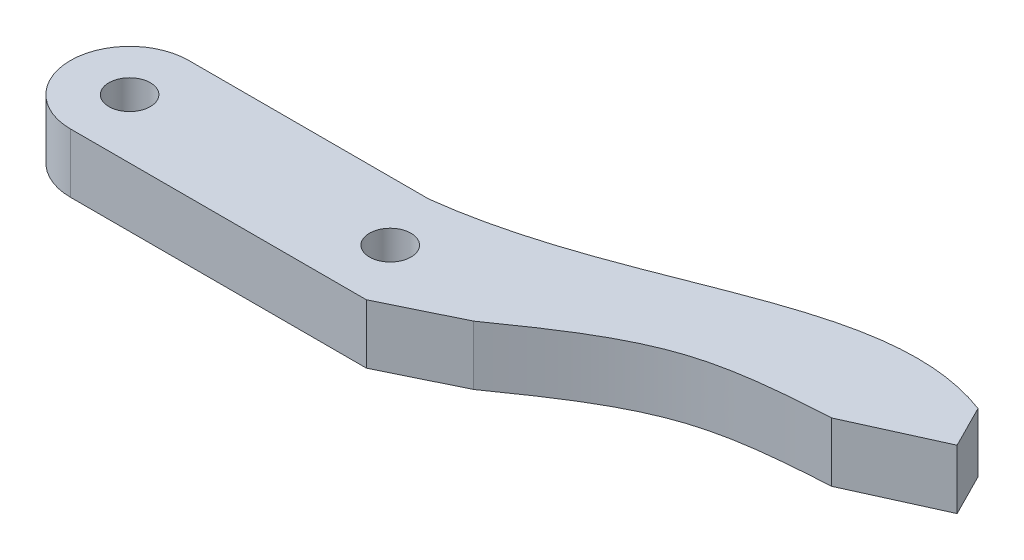
ISO-10303-21;
HEADER;
FILE_DESCRIPTION(('STEP AP214'),'2;1');
FILE_NAME('part.step','',(''),(''),'','','');
FILE_SCHEMA(('AUTOMOTIVE_DESIGN { 1 0 10303 214 1 1 1 1 }'));
ENDSEC;
DATA;
#1=APPLICATION_CONTEXT('core data for automotive mechanical design processes');
#2=APPLICATION_PROTOCOL_DEFINITION('international standard','automotive_design',2000,#1);
#3=PRODUCT_CONTEXT('',#1,'mechanical');
#4=PRODUCT('Part','Part','',(#3));
#5=PRODUCT_RELATED_PRODUCT_CATEGORY('part','',(#4));
#6=PRODUCT_DEFINITION_FORMATION('','',#4);
#7=PRODUCT_DEFINITION_CONTEXT('part definition',#1,'design');
#8=PRODUCT_DEFINITION('design','',#6,#7);
#9=PRODUCT_DEFINITION_SHAPE('','',#8);
#10=(LENGTH_UNIT() NAMED_UNIT(*) SI_UNIT(.MILLI.,.METRE.));
#11=(NAMED_UNIT(*) PLANE_ANGLE_UNIT() SI_UNIT($,.RADIAN.));
#12=(NAMED_UNIT(*) SI_UNIT($,.STERADIAN.) SOLID_ANGLE_UNIT());
#13=UNCERTAINTY_MEASURE_WITH_UNIT(LENGTH_MEASURE(1.E-05),#10,'distance_accuracy_value','');
#14=(GEOMETRIC_REPRESENTATION_CONTEXT(3) GLOBAL_UNCERTAINTY_ASSIGNED_CONTEXT((#13)) GLOBAL_UNIT_ASSIGNED_CONTEXT((#10,
#11,#12)) REPRESENTATION_CONTEXT('',''));
#15=CARTESIAN_POINT('',(0.,0.,0.));
#16=DIRECTION('',(0.,0.,1.));
#17=DIRECTION('',(1.,0.,0.));
#18=AXIS2_PLACEMENT_3D('',#15,#16,#17);
#19=CARTESIAN_POINT('',(0.,5.,-5.));
#20=DIRECTION('',(0.,0.,-1.));
#21=DIRECTION('',(-1.,0.,0.));
#22=AXIS2_PLACEMENT_3D('',#19,#20,#21);
#23=PLANE('',#22);
#24=DIRECTION('',(1.,0.,0.));
#25=VECTOR('',#24,1.);
#26=CARTESIAN_POINT('',(0.,5.,-5.));
#27=LINE('',#26,#25);
#28=CARTESIAN_POINT('',(0.,5.,-5.));
#29=VERTEX_POINT('',#28);
#30=CARTESIAN_POINT('',(20.2518777323325,5.,-5.));
#31=VERTEX_POINT('',#30);
#32=EDGE_CURVE('E223',#29,#31,#27,.T.);
#33=ORIENTED_EDGE('',*,*,#32,.T.);
#34=DIRECTION('',(0.,1.,0.));
#35=VECTOR('',#34,1.);
#36=CARTESIAN_POINT('',(20.2518777323325,0.,-5.));
#37=LINE('',#36,#35);
#38=CARTESIAN_POINT('',(20.2518777323325,0.,-5.));
#39=VERTEX_POINT('',#38);
#40=EDGE_CURVE('E139',#39,#31,#37,.T.);
#41=ORIENTED_EDGE('',*,*,#40,.F.);
#42=DIRECTION('',(1.,0.,0.));
#43=VECTOR('',#42,1.);
#44=CARTESIAN_POINT('',(0.,0.,-5.));
#45=LINE('',#44,#43);
#46=CARTESIAN_POINT('',(0.,0.,-5.));
#47=VERTEX_POINT('',#46);
#48=EDGE_CURVE('E126',#47,#39,#45,.T.);
#49=ORIENTED_EDGE('',*,*,#48,.F.);
#50=DIRECTION('',(0.,-1.,0.));
#51=VECTOR('',#50,1.);
#52=CARTESIAN_POINT('',(0.,5.,-5.));
#53=LINE('',#52,#51);
#54=EDGE_CURVE('E53',#29,#47,#53,.T.);
#55=ORIENTED_EDGE('',*,*,#54,.F.);
#56=EDGE_LOOP('',(#33,#41,#49,#55));
#57=FACE_BOUND('',#56,.T.);
#58=ADVANCED_FACE('F43',(#57),#23,.T.);
#59=CARTESIAN_POINT('',(0.,5.,0.));
#60=DIRECTION('',(0.,-1.,0.));
#61=DIRECTION('',(0.,0.,-1.));
#62=AXIS2_PLACEMENT_3D('',#59,#60,#61);
#63=CYLINDRICAL_SURFACE('',#62,5.);
#64=CARTESIAN_POINT('',(0.,0.,0.));
#65=DIRECTION('',(0.,1.,0.));
#66=DIRECTION('',(0.,0.,1.));
#67=AXIS2_PLACEMENT_3D('',#64,#65,#66);
#68=CIRCLE('',#67,5.);
#69=CARTESIAN_POINT('',(0.,0.,5.));
#70=VERTEX_POINT('',#69);
#71=EDGE_CURVE('E233',#47,#70,#68,.T.);
#72=ORIENTED_EDGE('',*,*,#71,.T.);
#73=DIRECTION('',(0.,-1.,0.));
#74=VECTOR('',#73,1.);
#75=CARTESIAN_POINT('',(0.,5.,5.));
#76=LINE('',#75,#74);
#77=CARTESIAN_POINT('',(0.,5.,5.));
#78=VERTEX_POINT('',#77);
#79=EDGE_CURVE('E11',#78,#70,#76,.T.);
#80=ORIENTED_EDGE('',*,*,#79,.F.);
#81=CARTESIAN_POINT('',(0.,5.,0.));
#82=DIRECTION('',(0.,1.,0.));
#83=DIRECTION('',(0.,0.,1.));
#84=AXIS2_PLACEMENT_3D('',#81,#82,#83);
#85=CIRCLE('',#84,5.);
#86=EDGE_CURVE('E217',#29,#78,#85,.T.);
#87=ORIENTED_EDGE('',*,*,#86,.F.);
#88=ORIENTED_EDGE('',*,*,#54,.T.);
#89=EDGE_LOOP('',(#72,#80,#87,#88));
#90=FACE_BOUND('',#89,.T.);
#91=ADVANCED_FACE('F245',(#90),#63,.T.);
#92=CARTESIAN_POINT('',(0.,5.,5.));
#93=DIRECTION('',(0.,0.,-1.));
#94=DIRECTION('',(-1.,0.,0.));
#95=AXIS2_PLACEMENT_3D('',#92,#93,#94);
#96=PLANE('',#95);
#97=DIRECTION('',(1.,0.,0.));
#98=VECTOR('',#97,1.);
#99=CARTESIAN_POINT('',(0.,0.,5.));
#100=LINE('',#99,#98);
#101=CARTESIAN_POINT('',(24.99,0.,5.));
#102=VERTEX_POINT('',#101);
#103=EDGE_CURVE('E72',#70,#102,#100,.T.);
#104=ORIENTED_EDGE('',*,*,#103,.T.);
#105=DIRECTION('',(0.,1.,0.));
#106=VECTOR('',#105,1.);
#107=CARTESIAN_POINT('',(24.99,0.,5.));
#108=LINE('',#107,#106);
#109=CARTESIAN_POINT('',(24.99,5.,5.));
#110=VERTEX_POINT('',#109);
#111=EDGE_CURVE('E197',#102,#110,#108,.T.);
#112=ORIENTED_EDGE('',*,*,#111,.T.);
#113=DIRECTION('',(1.,0.,0.));
#114=VECTOR('',#113,1.);
#115=CARTESIAN_POINT('',(0.,5.,5.));
#116=LINE('',#115,#114);
#117=EDGE_CURVE('E103',#78,#110,#116,.T.);
#118=ORIENTED_EDGE('',*,*,#117,.F.);
#119=ORIENTED_EDGE('',*,*,#79,.T.);
#120=EDGE_LOOP('',(#104,#112,#118,#119));
#121=FACE_BOUND('',#120,.T.);
#122=ADVANCED_FACE('F264',(#121),#96,.F.);
#123=CARTESIAN_POINT('',(0.,5.,0.));
#124=DIRECTION('',(0.,-1.,0.));
#125=DIRECTION('',(0.,0.,-1.));
#126=AXIS2_PLACEMENT_3D('',#123,#124,#125);
#127=CYLINDRICAL_SURFACE('',#126,1.75);
#128=CARTESIAN_POINT('',(0.,5.,0.));
#129=DIRECTION('',(0.,1.,0.));
#130=DIRECTION('',(0.,0.,1.));
#131=AXIS2_PLACEMENT_3D('',#128,#129,#130);
#132=CIRCLE('',#131,1.75);
#133=CARTESIAN_POINT('',(0.,5.,1.75));
#134=VERTEX_POINT('',#133);
#135=EDGE_CURVE('E213',#134,#134,#132,.T.);
#136=ORIENTED_EDGE('',*,*,#135,.T.);
#137=EDGE_LOOP('',(#136));
#138=FACE_BOUND('',#137,.T.);
#139=CARTESIAN_POINT('',(0.,0.,0.));
#140=DIRECTION('',(0.,1.,0.));
#141=DIRECTION('',(0.,0.,1.));
#142=AXIS2_PLACEMENT_3D('',#139,#140,#141);
#143=CIRCLE('',#142,1.75);
#144=CARTESIAN_POINT('',(0.,0.,1.75));
#145=VERTEX_POINT('',#144);
#146=EDGE_CURVE('E203',#145,#145,#143,.T.);
#147=ORIENTED_EDGE('',*,*,#146,.F.);
#148=EDGE_LOOP('',(#147));
#149=FACE_BOUND('',#148,.T.);
#150=ADVANCED_FACE('F45',(#138,#149),#127,.F.);
#151=CARTESIAN_POINT('',(22.,5.,0.));
#152=DIRECTION('',(0.,-1.,0.));
#153=DIRECTION('',(0.,0.,-1.));
#154=AXIS2_PLACEMENT_3D('',#151,#152,#153);
#155=CYLINDRICAL_SURFACE('',#154,1.75);
#156=CARTESIAN_POINT('',(22.,5.,0.));
#157=DIRECTION('',(0.,1.,0.));
#158=DIRECTION('',(0.,0.,1.));
#159=AXIS2_PLACEMENT_3D('',#156,#157,#158);
#160=CIRCLE('',#159,1.75);
#161=CARTESIAN_POINT('',(22.,5.,1.75));
#162=VERTEX_POINT('',#161);
#163=EDGE_CURVE('E226',#162,#162,#160,.T.);
#164=ORIENTED_EDGE('',*,*,#163,.T.);
#165=EDGE_LOOP('',(#164));
#166=FACE_BOUND('',#165,.T.);
#167=CARTESIAN_POINT('',(22.,0.,0.));
#168=DIRECTION('',(0.,1.,0.));
#169=DIRECTION('',(0.,0.,1.));
#170=AXIS2_PLACEMENT_3D('',#167,#168,#169);
#171=CIRCLE('',#170,1.75);
#172=CARTESIAN_POINT('',(22.,0.,1.75));
#173=VERTEX_POINT('',#172);
#174=EDGE_CURVE('E218',#173,#173,#171,.T.);
#175=ORIENTED_EDGE('',*,*,#174,.F.);
#176=EDGE_LOOP('',(#175));
#177=FACE_BOUND('',#176,.T.);
#178=ADVANCED_FACE('F271',(#166,#177),#155,.F.);
#179=CARTESIAN_POINT('',(0.,5.,0.));
#180=DIRECTION('',(0.,1.,0.));
#181=DIRECTION('',(0.,0.,1.));
#182=AXIS2_PLACEMENT_3D('',#179,#180,#181);
#183=PLANE('',#182);
#184=ORIENTED_EDGE('',*,*,#135,.F.);
#185=EDGE_LOOP('',(#184));
#186=FACE_BOUND('',#185,.T.);
#187=ORIENTED_EDGE('',*,*,#86,.T.);
#188=ORIENTED_EDGE('',*,*,#117,.T.);
#189=DIRECTION('',(0.898794046299166,0.,-0.438371146789079));
#190=VECTOR('',#189,1.);
#191=CARTESIAN_POINT('',(6.77233674982274,5.,13.8853480546302));
#192=LINE('',#191,#190);
#193=CARTESIAN_POINT('',(31.08,5.,2.02970853563389));
#194=VERTEX_POINT('',#193);
#195=EDGE_CURVE('E156',#110,#194,#192,.T.);
#196=ORIENTED_EDGE('',*,*,#195,.T.);
#197=CARTESIAN_POINT('',(31.08,5.,2.0297085356339));
#198=CARTESIAN_POINT('',(34.7497609427851,5.,-0.550345092392832));
#199=CARTESIAN_POINT('',(41.4510864784731,5.,-5.2617635009767));
#200=CARTESIAN_POINT('',(49.5886885616647,5.,-5.77005682771931));
#201=CARTESIAN_POINT('',(53.27,5.,-6.));
#202=B_SPLINE_CURVE_WITH_KNOTS('',3,(#197,#198,#199,#200,#201),.UNSPECIFIED.,.F.,.F.,(4,1,4),
(0.,0.547617172638723,1.),.UNSPECIFIED.);
#203=CARTESIAN_POINT('',(53.27,5.,-6.));
#204=VERTEX_POINT('',#203);
#205=EDGE_CURVE('E254',#194,#204,#202,.T.);
#206=ORIENTED_EDGE('',*,*,#205,.T.);
#207=DIRECTION('',(-0.910876713981416,0.,0.41267858186053));
#208=VECTOR('',#207,1.);
#209=CARTESIAN_POINT('',(6.81667754386652,5.,15.0459779459223));
#210=LINE('',#209,#208);
#211=CARTESIAN_POINT('',(60.5570137118513,5.,-9.30142865488424));
#212=VERTEX_POINT('',#211);
#213=EDGE_CURVE('E191',#212,#204,#210,.T.);
#214=ORIENTED_EDGE('',*,*,#213,.F.);
#215=DIRECTION('',(0.451753427962833,0.,0.892142836278939));
#216=VECTOR('',#215,1.);
#217=CARTESIAN_POINT('',(51.9472097518166,5.,-26.3044538656701));
#218=LINE('',#217,#216);
#219=CARTESIAN_POINT('',(58.75,5.,-12.87));
#220=VERTEX_POINT('',#219);
#221=EDGE_CURVE('E188',#220,#212,#218,.T.);
#222=ORIENTED_EDGE('',*,*,#221,.F.);
#223=CARTESIAN_POINT('',(11.,5.,-5.));
#224=CARTESIAN_POINT('',(31.6705966753384,5.,-2.42219328828116));
#225=CARTESIAN_POINT('',(44.410895383929,5.,-18.2251394880137));
#226=CARTESIAN_POINT('',(58.75,5.,-12.87));
#227=B_SPLINE_CURVE_WITH_KNOTS('',3,(#223,#224,#225,#226),.UNSPECIFIED.,.F.,.F.,(4,4),(0.,1.),.UNSPECIFIED.);
#228=EDGE_CURVE('E135',#31,#220,#227,.T.);
#229=ORIENTED_EDGE('',*,*,#228,.F.);
#230=ORIENTED_EDGE('',*,*,#32,.F.);
#231=EDGE_LOOP('',(#187,#188,#196,#206,#214,#222,#229,#230));
#232=FACE_BOUND('',#231,.T.);
#233=ORIENTED_EDGE('',*,*,#163,.F.);
#234=EDGE_LOOP('',(#233));
#235=FACE_BOUND('',#234,.T.);
#236=ADVANCED_FACE('F248',(#186,#232,#235),#183,.T.);
#237=CARTESIAN_POINT('',(0.,0.,0.));
#238=DIRECTION('',(0.,1.,0.));
#239=DIRECTION('',(0.,0.,1.));
#240=AXIS2_PLACEMENT_3D('',#237,#238,#239);
#241=PLANE('',#240);
#242=ORIENTED_EDGE('',*,*,#146,.T.);
#243=EDGE_LOOP('',(#242));
#244=FACE_BOUND('',#243,.T.);
#245=ORIENTED_EDGE('',*,*,#71,.F.);
#246=ORIENTED_EDGE('',*,*,#48,.T.);
#247=CARTESIAN_POINT('',(11.,0.,-5.));
#248=CARTESIAN_POINT('',(31.6705966753384,0.,-2.42219328828116));
#249=CARTESIAN_POINT('',(44.410895383929,0.,-18.2251394880137));
#250=CARTESIAN_POINT('',(58.75,0.,-12.87));
#251=B_SPLINE_CURVE_WITH_KNOTS('',3,(#247,#248,#249,#250),.UNSPECIFIED.,.F.,.F.,(4,4),(0.,1.),.UNSPECIFIED.);
#252=CARTESIAN_POINT('',(58.75,0.,-12.87));
#253=VERTEX_POINT('',#252);
#254=EDGE_CURVE('E119',#39,#253,#251,.T.);
#255=ORIENTED_EDGE('',*,*,#254,.T.);
#256=DIRECTION('',(0.451753427962833,0.,0.892142836278939));
#257=VECTOR('',#256,1.);
#258=CARTESIAN_POINT('',(51.9472097518166,0.,-26.3044538656701));
#259=LINE('',#258,#257);
#260=CARTESIAN_POINT('',(60.5570137118513,0.,-9.30142865488424));
#261=VERTEX_POINT('',#260);
#262=EDGE_CURVE('E124',#253,#261,#259,.T.);
#263=ORIENTED_EDGE('',*,*,#262,.T.);
#264=DIRECTION('',(-0.910876713981416,0.,0.41267858186053));
#265=VECTOR('',#264,1.);
#266=CARTESIAN_POINT('',(6.81667754386652,0.,15.0459779459223));
#267=LINE('',#266,#265);
#268=CARTESIAN_POINT('',(53.27,0.,-6.));
#269=VERTEX_POINT('',#268);
#270=EDGE_CURVE('E146',#261,#269,#267,.T.);
#271=ORIENTED_EDGE('',*,*,#270,.T.);
#272=CARTESIAN_POINT('',(31.08,0.,2.0297085356339));
#273=CARTESIAN_POINT('',(34.7497609427851,0.,-0.550345092392832));
#274=CARTESIAN_POINT('',(41.4510864784731,0.,-5.2617635009767));
#275=CARTESIAN_POINT('',(49.5886885616647,0.,-5.77005682771931));
#276=CARTESIAN_POINT('',(53.27,0.,-6.));
#277=B_SPLINE_CURVE_WITH_KNOTS('',3,(#272,#273,#274,#275,#276),.UNSPECIFIED.,.F.,.F.,(4,1,4),
(0.,0.547617172638723,1.),.UNSPECIFIED.);
#278=CARTESIAN_POINT('',(31.08,0.,2.02970853563389));
#279=VERTEX_POINT('',#278);
#280=EDGE_CURVE('E149',#279,#269,#277,.T.);
#281=ORIENTED_EDGE('',*,*,#280,.F.);
#282=DIRECTION('',(0.898794046299166,0.,-0.438371146789079));
#283=VECTOR('',#282,1.);
#284=CARTESIAN_POINT('',(6.77233674982274,0.,13.8853480546302));
#285=LINE('',#284,#283);
#286=EDGE_CURVE('E180',#102,#279,#285,.T.);
#287=ORIENTED_EDGE('',*,*,#286,.F.);
#288=ORIENTED_EDGE('',*,*,#103,.F.);
#289=EDGE_LOOP('',(#245,#246,#255,#263,#271,#281,#287,#288));
#290=FACE_BOUND('',#289,.T.);
#291=ORIENTED_EDGE('',*,*,#174,.T.);
#292=EDGE_LOOP('',(#291));
#293=FACE_BOUND('',#292,.T.);
#294=ADVANCED_FACE('F121',(#244,#290,#293),#241,.F.);
#295=CARTESIAN_POINT('',(6.77233674982274,0.,13.8853480546302));
#296=DIRECTION('',(0.438371146789079,0.,0.898794046299166));
#297=DIRECTION('',(0.898794046299166,0.,-0.438371146789079));
#298=AXIS2_PLACEMENT_3D('',#295,#296,#297);
#299=PLANE('',#298);
#300=ORIENTED_EDGE('',*,*,#195,.F.);
#301=ORIENTED_EDGE('',*,*,#111,.F.);
#302=ORIENTED_EDGE('',*,*,#286,.T.);
#303=DIRECTION('',(0.,1.,0.));
#304=VECTOR('',#303,1.);
#305=CARTESIAN_POINT('',(31.08,0.,2.02970853563389));
#306=LINE('',#305,#304);
#307=EDGE_CURVE('E110',#279,#194,#306,.T.);
#308=ORIENTED_EDGE('',*,*,#307,.T.);
#309=EDGE_LOOP('',(#300,#301,#302,#308));
#310=FACE_BOUND('',#309,.T.);
#311=ADVANCED_FACE('F164',(#310),#299,.T.);
#312=DIRECTION('',(0.,1.,0.));
#313=VECTOR('',#312,1.);
#314=SURFACE_OF_LINEAR_EXTRUSION('',#251,#313);
#315=ORIENTED_EDGE('',*,*,#228,.T.);
#316=DIRECTION('',(0.,1.,0.));
#317=VECTOR('',#316,1.);
#318=CARTESIAN_POINT('',(58.75,0.,-12.87));
#319=LINE('',#318,#317);
#320=EDGE_CURVE('E132',#253,#220,#319,.T.);
#321=ORIENTED_EDGE('',*,*,#320,.F.);
#322=ORIENTED_EDGE('',*,*,#254,.F.);
#323=ORIENTED_EDGE('',*,*,#40,.T.);
#324=EDGE_LOOP('',(#315,#321,#322,#323));
#325=FACE_BOUND('',#324,.T.);
#326=ADVANCED_FACE('F133',(#325),#314,.F.);
#327=CARTESIAN_POINT('',(51.9472097518166,0.,-26.3044538656701));
#328=DIRECTION('',(-0.892142836278939,0.,0.451753427962832));
#329=DIRECTION('',(0.451753427962833,0.,0.892142836278939));
#330=AXIS2_PLACEMENT_3D('',#327,#328,#329);
#331=PLANE('',#330);
#332=ORIENTED_EDGE('',*,*,#221,.T.);
#333=DIRECTION('',(0.,1.,0.));
#334=VECTOR('',#333,1.);
#335=CARTESIAN_POINT('',(60.5570137118513,0.,-9.30142865488424));
#336=LINE('',#335,#334);
#337=EDGE_CURVE('E140',#261,#212,#336,.T.);
#338=ORIENTED_EDGE('',*,*,#337,.F.);
#339=ORIENTED_EDGE('',*,*,#262,.F.);
#340=ORIENTED_EDGE('',*,*,#320,.T.);
#341=EDGE_LOOP('',(#332,#338,#339,#340));
#342=FACE_BOUND('',#341,.T.);
#343=ADVANCED_FACE('F142',(#342),#331,.F.);
#344=CARTESIAN_POINT('',(6.81667754386652,0.,15.0459779459223));
#345=DIRECTION('',(-0.41267858186053,0.,-0.910876713981416));
#346=DIRECTION('',(-0.910876713981416,0.,0.41267858186053));
#347=AXIS2_PLACEMENT_3D('',#344,#345,#346);
#348=PLANE('',#347);
#349=ORIENTED_EDGE('',*,*,#213,.T.);
#350=DIRECTION('',(0.,1.,0.));
#351=VECTOR('',#350,1.);
#352=CARTESIAN_POINT('',(53.27,0.,-6.));
#353=LINE('',#352,#351);
#354=EDGE_CURVE('E208',#269,#204,#353,.T.);
#355=ORIENTED_EDGE('',*,*,#354,.F.);
#356=ORIENTED_EDGE('',*,*,#270,.F.);
#357=ORIENTED_EDGE('',*,*,#337,.T.);
#358=EDGE_LOOP('',(#349,#355,#356,#357));
#359=FACE_BOUND('',#358,.T.);
#360=ADVANCED_FACE('F167',(#359),#348,.F.);
#361=DIRECTION('',(0.,1.,0.));
#362=VECTOR('',#361,1.);
#363=SURFACE_OF_LINEAR_EXTRUSION('',#277,#362);
#364=ORIENTED_EDGE('',*,*,#205,.F.);
#365=ORIENTED_EDGE('',*,*,#307,.F.);
#366=ORIENTED_EDGE('',*,*,#280,.T.);
#367=ORIENTED_EDGE('',*,*,#354,.T.);
#368=EDGE_LOOP('',(#364,#365,#366,#367));
#369=FACE_BOUND('',#368,.T.);
#370=ADVANCED_FACE('F170',(#369),#363,.T.);
#371=CLOSED_SHELL('',(#58,#91,#122,#150,#178,#236,#294,#311,#326,#343,#360,#370));
#372=MANIFOLD_SOLID_BREP('B2',#371);
#373=ADVANCED_BREP_SHAPE_REPRESENTATION('',(#18,#372),#14);
#374=SHAPE_DEFINITION_REPRESENTATION(#9,#373);
ENDSEC;
END-ISO-10303-21;
